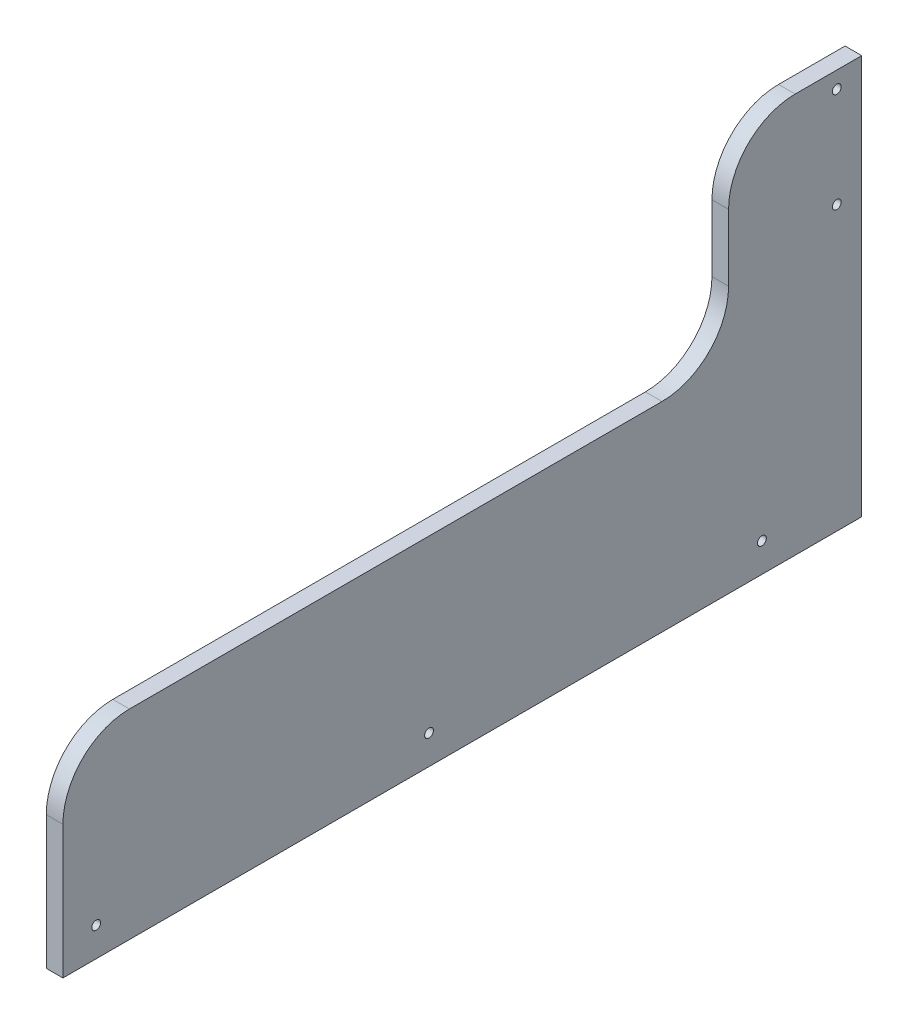
ISO-10303-21;
HEADER;
FILE_DESCRIPTION(('STEP AP214'),'2;1');
FILE_NAME('part.step','',(''),(''),'','','');
FILE_SCHEMA(('AUTOMOTIVE_DESIGN { 1 0 10303 214 1 1 1 1 }'));
ENDSEC;
DATA;
#1=APPLICATION_CONTEXT('core data for automotive mechanical design processes');
#2=APPLICATION_PROTOCOL_DEFINITION('international standard','automotive_design',2000,#1);
#3=PRODUCT_CONTEXT('',#1,'mechanical');
#4=PRODUCT('Part','Part','',(#3));
#5=PRODUCT_RELATED_PRODUCT_CATEGORY('part','',(#4));
#6=PRODUCT_DEFINITION_FORMATION('','',#4);
#7=PRODUCT_DEFINITION_CONTEXT('part definition',#1,'design');
#8=PRODUCT_DEFINITION('design','',#6,#7);
#9=PRODUCT_DEFINITION_SHAPE('','',#8);
#10=(LENGTH_UNIT() NAMED_UNIT(*) SI_UNIT(.MILLI.,.METRE.));
#11=(NAMED_UNIT(*) PLANE_ANGLE_UNIT() SI_UNIT($,.RADIAN.));
#12=(NAMED_UNIT(*) SI_UNIT($,.STERADIAN.) SOLID_ANGLE_UNIT());
#13=UNCERTAINTY_MEASURE_WITH_UNIT(LENGTH_MEASURE(1.E-05),#10,'distance_accuracy_value','');
#14=(GEOMETRIC_REPRESENTATION_CONTEXT(3) GLOBAL_UNCERTAINTY_ASSIGNED_CONTEXT((#13)) GLOBAL_UNIT_ASSIGNED_CONTEXT((#10,
#11,#12)) REPRESENTATION_CONTEXT('',''));
#15=CARTESIAN_POINT('',(0.,0.,0.));
#16=DIRECTION('',(0.,0.,1.));
#17=DIRECTION('',(1.,0.,0.));
#18=AXIS2_PLACEMENT_3D('',#15,#16,#17);
#19=CARTESIAN_POINT('',(12.7,0.,0.));
#20=DIRECTION('',(1.,0.,0.));
#21=DIRECTION('',(0.,0.,-1.));
#22=AXIS2_PLACEMENT_3D('',#19,#20,#21);
#23=PLANE('',#22);
#24=CARTESIAN_POINT('',(12.7,215.9,19.05));
#25=DIRECTION('',(1.,0.,0.));
#26=DIRECTION('',(0.,0.,-1.));
#27=AXIS2_PLACEMENT_3D('',#24,#25,#26);
#28=CIRCLE('',#27,3.3655);
#29=CARTESIAN_POINT('',(12.7,215.9,15.6845));
#30=VERTEX_POINT('',#29);
#31=EDGE_CURVE('E179',#30,#30,#28,.F.);
#32=ORIENTED_EDGE('',*,*,#31,.T.);
#33=EDGE_LOOP('',(#32));
#34=FACE_BOUND('',#33,.T.);
#35=CARTESIAN_POINT('',(12.7,292.1,19.05));
#36=DIRECTION('',(1.,0.,0.));
#37=DIRECTION('',(0.,0.,-1.));
#38=AXIS2_PLACEMENT_3D('',#35,#36,#37);
#39=CIRCLE('',#38,3.3655);
#40=CARTESIAN_POINT('',(12.7,292.1,15.6845));
#41=VERTEX_POINT('',#40);
#42=EDGE_CURVE('E182',#41,#41,#39,.F.);
#43=ORIENTED_EDGE('',*,*,#42,.T.);
#44=EDGE_LOOP('',(#43));
#45=FACE_BOUND('',#44,.T.);
#46=CARTESIAN_POINT('',(12.7,22.225,76.2));
#47=DIRECTION('',(1.,0.,0.));
#48=DIRECTION('',(0.,0.,-1.));
#49=AXIS2_PLACEMENT_3D('',#46,#47,#48);
#50=CIRCLE('',#49,3.3655);
#51=CARTESIAN_POINT('',(12.7,22.225,72.8345));
#52=VERTEX_POINT('',#51);
#53=EDGE_CURVE('E185',#52,#52,#50,.F.);
#54=ORIENTED_EDGE('',*,*,#53,.T.);
#55=EDGE_LOOP('',(#54));
#56=FACE_BOUND('',#55,.T.);
#57=CARTESIAN_POINT('',(12.7,22.225,330.2));
#58=DIRECTION('',(1.,0.,0.));
#59=DIRECTION('',(0.,0.,-1.));
#60=AXIS2_PLACEMENT_3D('',#57,#58,#59);
#61=CIRCLE('',#60,3.3655);
#62=CARTESIAN_POINT('',(12.7,22.225,326.8345));
#63=VERTEX_POINT('',#62);
#64=EDGE_CURVE('E188',#63,#63,#61,.F.);
#65=ORIENTED_EDGE('',*,*,#64,.T.);
#66=EDGE_LOOP('',(#65));
#67=FACE_BOUND('',#66,.T.);
#68=CARTESIAN_POINT('',(12.7,22.225,584.2));
#69=DIRECTION('',(1.,0.,0.));
#70=DIRECTION('',(0.,0.,-1.));
#71=AXIS2_PLACEMENT_3D('',#68,#69,#70);
#72=CIRCLE('',#71,3.3655);
#73=CARTESIAN_POINT('',(12.7,22.225,580.8345));
#74=VERTEX_POINT('',#73);
#75=EDGE_CURVE('E191',#74,#74,#72,.F.);
#76=ORIENTED_EDGE('',*,*,#75,.T.);
#77=EDGE_LOOP('',(#76));
#78=FACE_BOUND('',#77,.T.);
#79=DIRECTION('',(0.,0.,1.));
#80=VECTOR('',#79,1.);
#81=CARTESIAN_POINT('',(12.7,152.4,101.6));
#82=LINE('',#81,#80);
#83=CARTESIAN_POINT('',(12.7,152.4,558.8));
#84=VERTEX_POINT('',#83);
#85=CARTESIAN_POINT('',(12.7,152.4,152.4));
#86=VERTEX_POINT('',#85);
#87=EDGE_CURVE('E140',#84,#86,#82,.F.);
#88=ORIENTED_EDGE('',*,*,#87,.F.);
#89=CARTESIAN_POINT('',(12.7,101.6,558.8));
#90=DIRECTION('',(-1.,0.,0.));
#91=DIRECTION('',(0.,0.,1.));
#92=AXIS2_PLACEMENT_3D('',#89,#90,#91);
#93=CIRCLE('',#92,50.8);
#94=CARTESIAN_POINT('',(12.7,101.6,609.6));
#95=VERTEX_POINT('',#94);
#96=EDGE_CURVE('E19',#95,#84,#93,.T.);
#97=ORIENTED_EDGE('',*,*,#96,.F.);
#98=DIRECTION('',(0.,1.,0.));
#99=VECTOR('',#98,1.);
#100=CARTESIAN_POINT('',(12.7,152.4,609.6));
#101=LINE('',#100,#99);
#102=CARTESIAN_POINT('',(12.7,0.,609.6));
#103=VERTEX_POINT('',#102);
#104=EDGE_CURVE('E71',#103,#95,#101,.T.);
#105=ORIENTED_EDGE('',*,*,#104,.F.);
#106=DIRECTION('',(0.,0.,-1.));
#107=VECTOR('',#106,1.);
#108=CARTESIAN_POINT('',(12.7,0.,609.6));
#109=LINE('',#108,#107);
#110=CARTESIAN_POINT('',(12.7,0.,0.));
#111=VERTEX_POINT('',#110);
#112=EDGE_CURVE('E79',#111,#103,#109,.F.);
#113=ORIENTED_EDGE('',*,*,#112,.F.);
#114=DIRECTION('',(0.,1.,0.));
#115=VECTOR('',#114,1.);
#116=CARTESIAN_POINT('',(12.7,0.,0.));
#117=LINE('',#116,#115);
#118=CARTESIAN_POINT('',(12.7,304.8,0.));
#119=VERTEX_POINT('',#118);
#120=EDGE_CURVE('E129',#119,#111,#117,.F.);
#121=ORIENTED_EDGE('',*,*,#120,.F.);
#122=DIRECTION('',(0.,0.,1.));
#123=VECTOR('',#122,1.);
#124=CARTESIAN_POINT('',(12.7,304.8,0.));
#125=LINE('',#124,#123);
#126=CARTESIAN_POINT('',(12.7,304.8,50.8));
#127=VERTEX_POINT('',#126);
#128=EDGE_CURVE('E99',#127,#119,#125,.F.);
#129=ORIENTED_EDGE('',*,*,#128,.F.);
#130=CARTESIAN_POINT('',(12.7,254.,50.8));
#131=DIRECTION('',(-1.,0.,0.));
#132=DIRECTION('',(0.,0.,1.));
#133=AXIS2_PLACEMENT_3D('',#130,#131,#132);
#134=CIRCLE('',#133,50.8);
#135=CARTESIAN_POINT('',(12.7,254.,101.6));
#136=VERTEX_POINT('',#135);
#137=EDGE_CURVE('E103',#136,#127,#134,.T.);
#138=ORIENTED_EDGE('',*,*,#137,.F.);
#139=DIRECTION('',(0.,1.,0.));
#140=VECTOR('',#139,1.);
#141=CARTESIAN_POINT('',(12.7,304.8,101.6));
#142=LINE('',#141,#140);
#143=CARTESIAN_POINT('',(12.7,203.2,101.6));
#144=VERTEX_POINT('',#143);
#145=EDGE_CURVE('E143',#144,#136,#142,.T.);
#146=ORIENTED_EDGE('',*,*,#145,.F.);
#147=CARTESIAN_POINT('',(12.7,203.2,152.4));
#148=DIRECTION('',(1.,0.,0.));
#149=DIRECTION('',(0.,0.,-1.));
#150=AXIS2_PLACEMENT_3D('',#147,#148,#149);
#151=CIRCLE('',#150,50.8);
#152=EDGE_CURVE('E142',#144,#86,#151,.F.);
#153=ORIENTED_EDGE('',*,*,#152,.T.);
#154=EDGE_LOOP('',(#88,#97,#105,#113,#121,#129,#138,#146,#153));
#155=FACE_BOUND('',#154,.T.);
#156=ADVANCED_FACE('F16',(#34,#45,#56,#67,#78,#155),#23,.T.);
#157=CARTESIAN_POINT('',(75.06716,101.6,558.8));
#158=DIRECTION('',(-1.,0.,0.));
#159=DIRECTION('',(0.,0.,1.));
#160=AXIS2_PLACEMENT_3D('',#157,#158,#159);
#161=CYLINDRICAL_SURFACE('',#160,50.8);
#162=DIRECTION('',(1.,0.,0.));
#163=VECTOR('',#162,1.);
#164=CARTESIAN_POINT('',(0.,152.4,558.8));
#165=LINE('',#164,#163);
#166=CARTESIAN_POINT('',(0.,152.4,558.8));
#167=VERTEX_POINT('',#166);
#168=EDGE_CURVE('E194',#167,#84,#165,.T.);
#169=ORIENTED_EDGE('',*,*,#168,.F.);
#170=CARTESIAN_POINT('',(0.,101.6,558.8));
#171=DIRECTION('',(-1.,0.,0.));
#172=DIRECTION('',(0.,0.,1.));
#173=AXIS2_PLACEMENT_3D('',#170,#171,#172);
#174=CIRCLE('',#173,50.8);
#175=CARTESIAN_POINT('',(0.,101.6,609.6));
#176=VERTEX_POINT('',#175);
#177=EDGE_CURVE('E176',#167,#176,#174,.F.);
#178=ORIENTED_EDGE('',*,*,#177,.T.);
#179=DIRECTION('',(1.,0.,0.));
#180=VECTOR('',#179,1.);
#181=CARTESIAN_POINT('',(0.,101.6,609.6));
#182=LINE('',#181,#180);
#183=EDGE_CURVE('E138',#95,#176,#182,.F.);
#184=ORIENTED_EDGE('',*,*,#183,.F.);
#185=ORIENTED_EDGE('',*,*,#96,.T.);
#186=EDGE_LOOP('',(#169,#178,#184,#185));
#187=FACE_BOUND('',#186,.T.);
#188=ADVANCED_FACE('F356',(#187),#161,.T.);
#189=CARTESIAN_POINT('',(0.,152.4,609.6));
#190=DIRECTION('',(0.,0.,1.));
#191=DIRECTION('',(1.,0.,0.));
#192=AXIS2_PLACEMENT_3D('',#189,#190,#191);
#193=PLANE('',#192);
#194=ORIENTED_EDGE('',*,*,#104,.T.);
#195=ORIENTED_EDGE('',*,*,#183,.T.);
#196=DIRECTION('',(0.,1.,0.));
#197=VECTOR('',#196,1.);
#198=CARTESIAN_POINT('',(0.,0.,609.6));
#199=LINE('',#198,#197);
#200=CARTESIAN_POINT('',(0.,0.,609.6));
#201=VERTEX_POINT('',#200);
#202=EDGE_CURVE('E121',#176,#201,#199,.F.);
#203=ORIENTED_EDGE('',*,*,#202,.T.);
#204=DIRECTION('',(1.,0.,0.));
#205=VECTOR('',#204,1.);
#206=CARTESIAN_POINT('',(0.,0.,609.6));
#207=LINE('',#206,#205);
#208=EDGE_CURVE('E134',#103,#201,#207,.F.);
#209=ORIENTED_EDGE('',*,*,#208,.F.);
#210=EDGE_LOOP('',(#194,#195,#203,#209));
#211=FACE_BOUND('',#210,.T.);
#212=ADVANCED_FACE('F348',(#211),#193,.T.);
#213=CARTESIAN_POINT('',(0.,0.,609.6));
#214=DIRECTION('',(0.,-1.,0.));
#215=DIRECTION('',(0.,0.,-1.));
#216=AXIS2_PLACEMENT_3D('',#213,#214,#215);
#217=PLANE('',#216);
#218=ORIENTED_EDGE('',*,*,#208,.T.);
#219=DIRECTION('',(0.,0.,-1.));
#220=VECTOR('',#219,1.);
#221=CARTESIAN_POINT('',(0.,0.,0.));
#222=LINE('',#221,#220);
#223=CARTESIAN_POINT('',(0.,0.,0.));
#224=VERTEX_POINT('',#223);
#225=EDGE_CURVE('E119',#201,#224,#222,.T.);
#226=ORIENTED_EDGE('',*,*,#225,.T.);
#227=DIRECTION('',(-1.,0.,0.));
#228=VECTOR('',#227,1.);
#229=CARTESIAN_POINT('',(0.,0.,0.));
#230=LINE('',#229,#228);
#231=EDGE_CURVE('E118',#111,#224,#230,.T.);
#232=ORIENTED_EDGE('',*,*,#231,.F.);
#233=ORIENTED_EDGE('',*,*,#112,.T.);
#234=EDGE_LOOP('',(#218,#226,#232,#233));
#235=FACE_BOUND('',#234,.T.);
#236=ADVANCED_FACE('F340',(#235),#217,.T.);
#237=CARTESIAN_POINT('',(0.,0.,0.));
#238=DIRECTION('',(0.,0.,-1.));
#239=DIRECTION('',(-1.,0.,0.));
#240=AXIS2_PLACEMENT_3D('',#237,#238,#239);
#241=PLANE('',#240);
#242=ORIENTED_EDGE('',*,*,#231,.T.);
#243=DIRECTION('',(0.,1.,0.));
#244=VECTOR('',#243,1.);
#245=CARTESIAN_POINT('',(0.,0.,0.));
#246=LINE('',#245,#244);
#247=CARTESIAN_POINT('',(0.,304.8,0.));
#248=VERTEX_POINT('',#247);
#249=EDGE_CURVE('E111',#224,#248,#246,.T.);
#250=ORIENTED_EDGE('',*,*,#249,.T.);
#251=DIRECTION('',(1.,0.,0.));
#252=VECTOR('',#251,1.);
#253=CARTESIAN_POINT('',(0.,304.8,0.));
#254=LINE('',#253,#252);
#255=EDGE_CURVE('E93',#119,#248,#254,.F.);
#256=ORIENTED_EDGE('',*,*,#255,.F.);
#257=ORIENTED_EDGE('',*,*,#120,.T.);
#258=EDGE_LOOP('',(#242,#250,#256,#257));
#259=FACE_BOUND('',#258,.T.);
#260=ADVANCED_FACE('F117',(#259),#241,.T.);
#261=CARTESIAN_POINT('',(0.,304.8,0.));
#262=DIRECTION('',(0.,1.,0.));
#263=DIRECTION('',(0.,0.,1.));
#264=AXIS2_PLACEMENT_3D('',#261,#262,#263);
#265=PLANE('',#264);
#266=DIRECTION('',(0.,0.,-1.));
#267=VECTOR('',#266,1.);
#268=CARTESIAN_POINT('',(0.,304.8,0.));
#269=LINE('',#268,#267);
#270=CARTESIAN_POINT('',(0.,304.8,50.8));
#271=VERTEX_POINT('',#270);
#272=EDGE_CURVE('E97',#248,#271,#269,.F.);
#273=ORIENTED_EDGE('',*,*,#272,.T.);
#274=DIRECTION('',(-1.,0.,0.));
#275=VECTOR('',#274,1.);
#276=CARTESIAN_POINT('',(75.06716,304.8,50.8));
#277=LINE('',#276,#275);
#278=EDGE_CURVE('E146',#127,#271,#277,.T.);
#279=ORIENTED_EDGE('',*,*,#278,.F.);
#280=ORIENTED_EDGE('',*,*,#128,.T.);
#281=ORIENTED_EDGE('',*,*,#255,.T.);
#282=EDGE_LOOP('',(#273,#279,#280,#281));
#283=FACE_BOUND('',#282,.T.);
#284=ADVANCED_FACE('F95',(#283),#265,.T.);
#285=CARTESIAN_POINT('',(75.06716,254.,50.8));
#286=DIRECTION('',(-1.,0.,0.));
#287=DIRECTION('',(0.,0.,1.));
#288=AXIS2_PLACEMENT_3D('',#285,#286,#287);
#289=CYLINDRICAL_SURFACE('',#288,50.8);
#290=ORIENTED_EDGE('',*,*,#278,.T.);
#291=CARTESIAN_POINT('',(0.,254.,50.8));
#292=DIRECTION('',(-1.,0.,0.));
#293=DIRECTION('',(0.,0.,1.));
#294=AXIS2_PLACEMENT_3D('',#291,#292,#293);
#295=CIRCLE('',#294,50.8);
#296=CARTESIAN_POINT('',(0.,254.,101.6));
#297=VERTEX_POINT('',#296);
#298=EDGE_CURVE('E115',#271,#297,#295,.F.);
#299=ORIENTED_EDGE('',*,*,#298,.T.);
#300=DIRECTION('',(1.,0.,0.));
#301=VECTOR('',#300,1.);
#302=CARTESIAN_POINT('',(0.,254.,101.6));
#303=LINE('',#302,#301);
#304=EDGE_CURVE('E145',#136,#297,#303,.F.);
#305=ORIENTED_EDGE('',*,*,#304,.F.);
#306=ORIENTED_EDGE('',*,*,#137,.T.);
#307=EDGE_LOOP('',(#290,#299,#305,#306));
#308=FACE_BOUND('',#307,.T.);
#309=ADVANCED_FACE('F225',(#308),#289,.T.);
#310=CARTESIAN_POINT('',(0.,304.8,101.6));
#311=DIRECTION('',(0.,0.,1.));
#312=DIRECTION('',(1.,0.,0.));
#313=AXIS2_PLACEMENT_3D('',#310,#311,#312);
#314=PLANE('',#313);
#315=ORIENTED_EDGE('',*,*,#145,.T.);
#316=ORIENTED_EDGE('',*,*,#304,.T.);
#317=DIRECTION('',(0.,1.,0.));
#318=VECTOR('',#317,1.);
#319=CARTESIAN_POINT('',(0.,0.,101.6));
#320=LINE('',#319,#318);
#321=CARTESIAN_POINT('',(0.,203.2,101.6));
#322=VERTEX_POINT('',#321);
#323=EDGE_CURVE('E174',#297,#322,#320,.F.);
#324=ORIENTED_EDGE('',*,*,#323,.T.);
#325=DIRECTION('',(1.,0.,0.));
#326=VECTOR('',#325,1.);
#327=CARTESIAN_POINT('',(-62.36716,203.2,101.6));
#328=LINE('',#327,#326);
#329=EDGE_CURVE('E196',#322,#144,#328,.T.);
#330=ORIENTED_EDGE('',*,*,#329,.T.);
#331=EDGE_LOOP('',(#315,#316,#324,#330));
#332=FACE_BOUND('',#331,.T.);
#333=ADVANCED_FACE('F224',(#332),#314,.T.);
#334=CARTESIAN_POINT('',(-62.36716,203.2,152.4));
#335=DIRECTION('',(1.,0.,0.));
#336=DIRECTION('',(0.,0.,-1.));
#337=AXIS2_PLACEMENT_3D('',#334,#335,#336);
#338=CYLINDRICAL_SURFACE('',#337,50.8);
#339=ORIENTED_EDGE('',*,*,#329,.F.);
#340=CARTESIAN_POINT('',(0.,203.2,152.4));
#341=DIRECTION('',(1.,0.,0.));
#342=DIRECTION('',(0.,0.,-1.));
#343=AXIS2_PLACEMENT_3D('',#340,#341,#342);
#344=CIRCLE('',#343,50.8);
#345=CARTESIAN_POINT('',(0.,152.4,152.4));
#346=VERTEX_POINT('',#345);
#347=EDGE_CURVE('E171',#322,#346,#344,.F.);
#348=ORIENTED_EDGE('',*,*,#347,.T.);
#349=DIRECTION('',(1.,0.,0.));
#350=VECTOR('',#349,1.);
#351=CARTESIAN_POINT('',(0.,152.4,152.4));
#352=LINE('',#351,#350);
#353=EDGE_CURVE('E34',#86,#346,#352,.F.);
#354=ORIENTED_EDGE('',*,*,#353,.F.);
#355=ORIENTED_EDGE('',*,*,#152,.F.);
#356=EDGE_LOOP('',(#339,#348,#354,#355));
#357=FACE_BOUND('',#356,.T.);
#358=ADVANCED_FACE('F221',(#357),#338,.F.);
#359=CARTESIAN_POINT('',(0.,152.4,101.6));
#360=DIRECTION('',(0.,1.,0.));
#361=DIRECTION('',(0.,0.,1.));
#362=AXIS2_PLACEMENT_3D('',#359,#360,#361);
#363=PLANE('',#362);
#364=DIRECTION('',(0.,0.,-1.));
#365=VECTOR('',#364,1.);
#366=CARTESIAN_POINT('',(0.,152.4,0.));
#367=LINE('',#366,#365);
#368=EDGE_CURVE('E170',#346,#167,#367,.F.);
#369=ORIENTED_EDGE('',*,*,#368,.T.);
#370=ORIENTED_EDGE('',*,*,#168,.T.);
#371=ORIENTED_EDGE('',*,*,#87,.T.);
#372=ORIENTED_EDGE('',*,*,#353,.T.);
#373=EDGE_LOOP('',(#369,#370,#371,#372));
#374=FACE_BOUND('',#373,.T.);
#375=ADVANCED_FACE('F216',(#374),#363,.T.);
#376=CARTESIAN_POINT('',(12.7,22.225,584.2));
#377=DIRECTION('',(1.,0.,0.));
#378=DIRECTION('',(0.,0.,-1.));
#379=AXIS2_PLACEMENT_3D('',#376,#377,#378);
#380=CYLINDRICAL_SURFACE('',#379,3.3655);
#381=ORIENTED_EDGE('',*,*,#75,.F.);
#382=EDGE_LOOP('',(#381));
#383=FACE_BOUND('',#382,.T.);
#384=CARTESIAN_POINT('',(0.,22.225,584.2));
#385=DIRECTION('',(1.,0.,0.));
#386=DIRECTION('',(0.,0.,-1.));
#387=AXIS2_PLACEMENT_3D('',#384,#385,#386);
#388=CIRCLE('',#387,3.3655);
#389=CARTESIAN_POINT('',(0.,22.225,580.8345));
#390=VERTEX_POINT('',#389);
#391=EDGE_CURVE('E167',#390,#390,#388,.F.);
#392=ORIENTED_EDGE('',*,*,#391,.T.);
#393=EDGE_LOOP('',(#392));
#394=FACE_BOUND('',#393,.T.);
#395=ADVANCED_FACE('F258',(#383,#394),#380,.F.);
#396=CARTESIAN_POINT('',(12.7,22.225,330.2));
#397=DIRECTION('',(1.,0.,0.));
#398=DIRECTION('',(0.,0.,-1.));
#399=AXIS2_PLACEMENT_3D('',#396,#397,#398);
#400=CYLINDRICAL_SURFACE('',#399,3.3655);
#401=ORIENTED_EDGE('',*,*,#64,.F.);
#402=EDGE_LOOP('',(#401));
#403=FACE_BOUND('',#402,.T.);
#404=CARTESIAN_POINT('',(0.,22.225,330.2));
#405=DIRECTION('',(1.,0.,0.));
#406=DIRECTION('',(0.,0.,-1.));
#407=AXIS2_PLACEMENT_3D('',#404,#405,#406);
#408=CIRCLE('',#407,3.3655);
#409=CARTESIAN_POINT('',(0.,22.225,326.8345));
#410=VERTEX_POINT('',#409);
#411=EDGE_CURVE('E164',#410,#410,#408,.F.);
#412=ORIENTED_EDGE('',*,*,#411,.T.);
#413=EDGE_LOOP('',(#412));
#414=FACE_BOUND('',#413,.T.);
#415=ADVANCED_FACE('F254',(#403,#414),#400,.F.);
#416=CARTESIAN_POINT('',(12.7,22.225,76.2));
#417=DIRECTION('',(1.,0.,0.));
#418=DIRECTION('',(0.,0.,-1.));
#419=AXIS2_PLACEMENT_3D('',#416,#417,#418);
#420=CYLINDRICAL_SURFACE('',#419,3.3655);
#421=ORIENTED_EDGE('',*,*,#53,.F.);
#422=EDGE_LOOP('',(#421));
#423=FACE_BOUND('',#422,.T.);
#424=CARTESIAN_POINT('',(0.,22.225,76.2));
#425=DIRECTION('',(1.,0.,0.));
#426=DIRECTION('',(0.,0.,-1.));
#427=AXIS2_PLACEMENT_3D('',#424,#425,#426);
#428=CIRCLE('',#427,3.3655);
#429=CARTESIAN_POINT('',(0.,22.225,72.8345));
#430=VERTEX_POINT('',#429);
#431=EDGE_CURVE('E161',#430,#430,#428,.F.);
#432=ORIENTED_EDGE('',*,*,#431,.T.);
#433=EDGE_LOOP('',(#432));
#434=FACE_BOUND('',#433,.T.);
#435=ADVANCED_FACE('F250',(#423,#434),#420,.F.);
#436=CARTESIAN_POINT('',(12.7,292.1,19.05));
#437=DIRECTION('',(1.,0.,0.));
#438=DIRECTION('',(0.,0.,-1.));
#439=AXIS2_PLACEMENT_3D('',#436,#437,#438);
#440=CYLINDRICAL_SURFACE('',#439,3.3655);
#441=CARTESIAN_POINT('',(0.,292.1,19.05));
#442=DIRECTION('',(1.,0.,0.));
#443=DIRECTION('',(0.,0.,-1.));
#444=AXIS2_PLACEMENT_3D('',#441,#442,#443);
#445=CIRCLE('',#444,3.3655);
#446=CARTESIAN_POINT('',(0.,292.1,15.6845));
#447=VERTEX_POINT('',#446);
#448=EDGE_CURVE('E25',#447,#447,#445,.F.);
#449=ORIENTED_EDGE('',*,*,#448,.T.);
#450=EDGE_LOOP('',(#449));
#451=FACE_BOUND('',#450,.T.);
#452=ORIENTED_EDGE('',*,*,#42,.F.);
#453=EDGE_LOOP('',(#452));
#454=FACE_BOUND('',#453,.T.);
#455=ADVANCED_FACE('F242',(#451,#454),#440,.F.);
#456=CARTESIAN_POINT('',(12.7,215.9,19.05));
#457=DIRECTION('',(1.,0.,0.));
#458=DIRECTION('',(0.,0.,-1.));
#459=AXIS2_PLACEMENT_3D('',#456,#457,#458);
#460=CYLINDRICAL_SURFACE('',#459,3.3655);
#461=CARTESIAN_POINT('',(0.,215.9,19.05));
#462=DIRECTION('',(1.,0.,0.));
#463=DIRECTION('',(0.,0.,-1.));
#464=AXIS2_PLACEMENT_3D('',#461,#462,#463);
#465=CIRCLE('',#464,3.3655);
#466=CARTESIAN_POINT('',(0.,215.9,15.6845));
#467=VERTEX_POINT('',#466);
#468=EDGE_CURVE('E11',#467,#467,#465,.F.);
#469=ORIENTED_EDGE('',*,*,#468,.T.);
#470=EDGE_LOOP('',(#469));
#471=FACE_BOUND('',#470,.T.);
#472=ORIENTED_EDGE('',*,*,#31,.F.);
#473=EDGE_LOOP('',(#472));
#474=FACE_BOUND('',#473,.T.);
#475=ADVANCED_FACE('F236',(#471,#474),#460,.F.);
#476=CARTESIAN_POINT('',(0.,0.,0.));
#477=DIRECTION('',(1.,0.,0.));
#478=DIRECTION('',(0.,0.,-1.));
#479=AXIS2_PLACEMENT_3D('',#476,#477,#478);
#480=PLANE('',#479);
#481=ORIENTED_EDGE('',*,*,#468,.F.);
#482=EDGE_LOOP('',(#481));
#483=FACE_BOUND('',#482,.T.);
#484=ORIENTED_EDGE('',*,*,#448,.F.);
#485=EDGE_LOOP('',(#484));
#486=FACE_BOUND('',#485,.T.);
#487=ORIENTED_EDGE('',*,*,#431,.F.);
#488=EDGE_LOOP('',(#487));
#489=FACE_BOUND('',#488,.T.);
#490=ORIENTED_EDGE('',*,*,#411,.F.);
#491=EDGE_LOOP('',(#490));
#492=FACE_BOUND('',#491,.T.);
#493=ORIENTED_EDGE('',*,*,#391,.F.);
#494=EDGE_LOOP('',(#493));
#495=FACE_BOUND('',#494,.T.);
#496=ORIENTED_EDGE('',*,*,#347,.F.);
#497=ORIENTED_EDGE('',*,*,#323,.F.);
#498=ORIENTED_EDGE('',*,*,#298,.F.);
#499=ORIENTED_EDGE('',*,*,#272,.F.);
#500=ORIENTED_EDGE('',*,*,#249,.F.);
#501=ORIENTED_EDGE('',*,*,#225,.F.);
#502=ORIENTED_EDGE('',*,*,#202,.F.);
#503=ORIENTED_EDGE('',*,*,#177,.F.);
#504=ORIENTED_EDGE('',*,*,#368,.F.);
#505=EDGE_LOOP('',(#496,#497,#498,#499,#500,#501,#502,#503,#504));
#506=FACE_BOUND('',#505,.T.);
#507=ADVANCED_FACE('F109',(#483,#486,#489,#492,#495,#506),#480,.F.);
#508=CLOSED_SHELL('',(#156,#188,#212,#236,#260,#284,#309,#333,#358,#375,#395,#415,#435,#455,
#475,#507));
#509=MANIFOLD_SOLID_BREP('B1',#508);
#510=ADVANCED_BREP_SHAPE_REPRESENTATION('',(#18,#509),#14);
#511=SHAPE_DEFINITION_REPRESENTATION(#9,#510);
ENDSEC;
END-ISO-10303-21;
